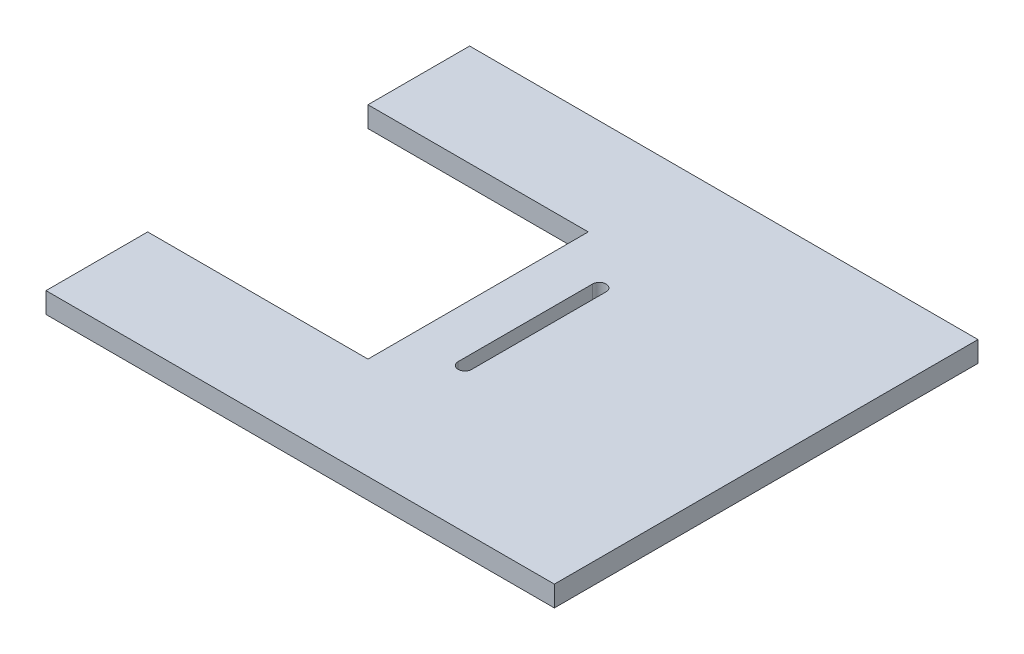
ISO-10303-21;
HEADER;
FILE_DESCRIPTION(('STEP AP214'),'2;1');
FILE_NAME('part.step','',(''),(''),'','','');
FILE_SCHEMA(('AUTOMOTIVE_DESIGN { 1 0 10303 214 1 1 1 1 }'));
ENDSEC;
DATA;
#1=APPLICATION_CONTEXT('core data for automotive mechanical design processes');
#2=APPLICATION_PROTOCOL_DEFINITION('international standard','automotive_design',2000,#1);
#3=PRODUCT_CONTEXT('',#1,'mechanical');
#4=PRODUCT('Part','Part','',(#3));
#5=PRODUCT_RELATED_PRODUCT_CATEGORY('part','',(#4));
#6=PRODUCT_DEFINITION_FORMATION('','',#4);
#7=PRODUCT_DEFINITION_CONTEXT('part definition',#1,'design');
#8=PRODUCT_DEFINITION('design','',#6,#7);
#9=PRODUCT_DEFINITION_SHAPE('','',#8);
#10=(LENGTH_UNIT() NAMED_UNIT(*) SI_UNIT(.MILLI.,.METRE.));
#11=(NAMED_UNIT(*) PLANE_ANGLE_UNIT() SI_UNIT($,.RADIAN.));
#12=(NAMED_UNIT(*) SI_UNIT($,.STERADIAN.) SOLID_ANGLE_UNIT());
#13=UNCERTAINTY_MEASURE_WITH_UNIT(LENGTH_MEASURE(1.E-05),#10,'distance_accuracy_value','');
#14=(GEOMETRIC_REPRESENTATION_CONTEXT(3) GLOBAL_UNCERTAINTY_ASSIGNED_CONTEXT((#13)) GLOBAL_UNIT_ASSIGNED_CONTEXT((#10,
#11,#12)) REPRESENTATION_CONTEXT('',''));
#15=CARTESIAN_POINT('',(0.,0.,0.));
#16=DIRECTION('',(0.,0.,1.));
#17=DIRECTION('',(1.,0.,0.));
#18=AXIS2_PLACEMENT_3D('',#15,#16,#17);
#19=CARTESIAN_POINT('',(0.,12.2,-65.));
#20=DIRECTION('',(0.,0.,-1.));
#21=DIRECTION('',(-1.,0.,0.));
#22=AXIS2_PLACEMENT_3D('',#19,#20,#21);
#23=PLANE('',#22);
#24=DIRECTION('',(1.,0.,0.));
#25=VECTOR('',#24,1.);
#26=CARTESIAN_POINT('',(0.,0.,-65.));
#27=LINE('',#26,#25);
#28=CARTESIAN_POINT('',(-150.,0.,-65.));
#29=VERTEX_POINT('',#28);
#30=CARTESIAN_POINT('',(-19.9999999999999,0.,-65.));
#31=VERTEX_POINT('',#30);
#32=EDGE_CURVE('E159',#29,#31,#27,.T.);
#33=ORIENTED_EDGE('',*,*,#32,.T.);
#34=DIRECTION('',(0.,-1.,0.));
#35=VECTOR('',#34,1.);
#36=CARTESIAN_POINT('',(-19.9999999999999,12.2,-65.));
#37=LINE('',#36,#35);
#38=CARTESIAN_POINT('',(-19.9999999999999,12.2,-65.));
#39=VERTEX_POINT('',#38);
#40=EDGE_CURVE('E240',#39,#31,#37,.T.);
#41=ORIENTED_EDGE('',*,*,#40,.F.);
#42=DIRECTION('',(1.,0.,0.));
#43=VECTOR('',#42,1.);
#44=CARTESIAN_POINT('',(0.,12.2,-65.));
#45=LINE('',#44,#43);
#46=CARTESIAN_POINT('',(-150.,12.2,-65.));
#47=VERTEX_POINT('',#46);
#48=EDGE_CURVE('E164',#47,#39,#45,.T.);
#49=ORIENTED_EDGE('',*,*,#48,.F.);
#50=DIRECTION('',(0.,-1.,0.));
#51=VECTOR('',#50,1.);
#52=CARTESIAN_POINT('',(-150.,12.2,-65.));
#53=LINE('',#52,#51);
#54=EDGE_CURVE('E217',#47,#29,#53,.T.);
#55=ORIENTED_EDGE('',*,*,#54,.T.);
#56=EDGE_LOOP('',(#33,#41,#49,#55));
#57=FACE_BOUND('',#56,.T.);
#58=ADVANCED_FACE('F39',(#57),#23,.F.);
#59=CARTESIAN_POINT('',(-19.9999999999999,12.2,0.));
#60=DIRECTION('',(1.,0.,0.));
#61=DIRECTION('',(0.,0.,-1.));
#62=AXIS2_PLACEMENT_3D('',#59,#60,#61);
#63=PLANE('',#62);
#64=DIRECTION('',(0.,0.,1.));
#65=VECTOR('',#64,1.);
#66=CARTESIAN_POINT('',(-19.9999999999999,0.,0.));
#67=LINE('',#66,#65);
#68=CARTESIAN_POINT('',(-19.9999999999999,0.,65.));
#69=VERTEX_POINT('',#68);
#70=EDGE_CURVE('E194',#31,#69,#67,.T.);
#71=ORIENTED_EDGE('',*,*,#70,.T.);
#72=DIRECTION('',(0.,-1.,0.));
#73=VECTOR('',#72,1.);
#74=CARTESIAN_POINT('',(-19.9999999999999,12.2,65.));
#75=LINE('',#74,#73);
#76=CARTESIAN_POINT('',(-19.9999999999999,12.2,65.));
#77=VERTEX_POINT('',#76);
#78=EDGE_CURVE('E237',#77,#69,#75,.T.);
#79=ORIENTED_EDGE('',*,*,#78,.F.);
#80=DIRECTION('',(0.,0.,1.));
#81=VECTOR('',#80,1.);
#82=CARTESIAN_POINT('',(-19.9999999999999,12.2,0.));
#83=LINE('',#82,#81);
#84=EDGE_CURVE('E168',#39,#77,#83,.T.);
#85=ORIENTED_EDGE('',*,*,#84,.F.);
#86=ORIENTED_EDGE('',*,*,#40,.T.);
#87=EDGE_LOOP('',(#71,#79,#85,#86));
#88=FACE_BOUND('',#87,.T.);
#89=ADVANCED_FACE('F268',(#88),#63,.F.);
#90=CARTESIAN_POINT('',(0.,12.2,65.));
#91=DIRECTION('',(0.,0.,-1.));
#92=DIRECTION('',(-1.,0.,0.));
#93=AXIS2_PLACEMENT_3D('',#90,#91,#92);
#94=PLANE('',#93);
#95=DIRECTION('',(1.,0.,0.));
#96=VECTOR('',#95,1.);
#97=CARTESIAN_POINT('',(0.,0.,65.));
#98=LINE('',#97,#96);
#99=CARTESIAN_POINT('',(-150.,0.,65.));
#100=VERTEX_POINT('',#99);
#101=EDGE_CURVE('E198',#100,#69,#98,.T.);
#102=ORIENTED_EDGE('',*,*,#101,.F.);
#103=DIRECTION('',(0.,-1.,0.));
#104=VECTOR('',#103,1.);
#105=CARTESIAN_POINT('',(-150.,12.2,65.));
#106=LINE('',#105,#104);
#107=CARTESIAN_POINT('',(-150.,12.2,65.));
#108=VERTEX_POINT('',#107);
#109=EDGE_CURVE('E234',#108,#100,#106,.T.);
#110=ORIENTED_EDGE('',*,*,#109,.F.);
#111=DIRECTION('',(1.,0.,0.));
#112=VECTOR('',#111,1.);
#113=CARTESIAN_POINT('',(0.,12.2,65.));
#114=LINE('',#113,#112);
#115=EDGE_CURVE('E172',#108,#77,#114,.T.);
#116=ORIENTED_EDGE('',*,*,#115,.T.);
#117=ORIENTED_EDGE('',*,*,#78,.T.);
#118=EDGE_LOOP('',(#102,#110,#116,#117));
#119=FACE_BOUND('',#118,.T.);
#120=ADVANCED_FACE('F273',(#119),#94,.T.);
#121=CARTESIAN_POINT('',(-150.,12.2,0.));
#122=DIRECTION('',(1.,0.,0.));
#123=DIRECTION('',(0.,0.,-1.));
#124=AXIS2_PLACEMENT_3D('',#121,#122,#123);
#125=PLANE('',#124);
#126=DIRECTION('',(0.,0.,1.));
#127=VECTOR('',#126,1.);
#128=CARTESIAN_POINT('',(-150.,0.,0.));
#129=LINE('',#128,#127);
#130=CARTESIAN_POINT('',(-150.,0.,125.));
#131=VERTEX_POINT('',#130);
#132=EDGE_CURVE('E202',#100,#131,#129,.T.);
#133=ORIENTED_EDGE('',*,*,#132,.T.);
#134=DIRECTION('',(0.,-1.,0.));
#135=VECTOR('',#134,1.);
#136=CARTESIAN_POINT('',(-150.,12.2,125.));
#137=LINE('',#136,#135);
#138=CARTESIAN_POINT('',(-150.,12.2,125.));
#139=VERTEX_POINT('',#138);
#140=EDGE_CURVE('E230',#139,#131,#137,.T.);
#141=ORIENTED_EDGE('',*,*,#140,.F.);
#142=DIRECTION('',(0.,0.,1.));
#143=VECTOR('',#142,1.);
#144=CARTESIAN_POINT('',(-150.,12.2,0.));
#145=LINE('',#144,#143);
#146=EDGE_CURVE('E176',#108,#139,#145,.T.);
#147=ORIENTED_EDGE('',*,*,#146,.F.);
#148=ORIENTED_EDGE('',*,*,#109,.T.);
#149=EDGE_LOOP('',(#133,#141,#147,#148));
#150=FACE_BOUND('',#149,.T.);
#151=ADVANCED_FACE('F305',(#150),#125,.F.);
#152=CARTESIAN_POINT('',(0.,12.2,125.));
#153=DIRECTION('',(0.,0.,-1.));
#154=DIRECTION('',(-1.,0.,0.));
#155=AXIS2_PLACEMENT_3D('',#152,#153,#154);
#156=PLANE('',#155);
#157=DIRECTION('',(1.,0.,0.));
#158=VECTOR('',#157,1.);
#159=CARTESIAN_POINT('',(0.,0.,125.));
#160=LINE('',#159,#158);
#161=CARTESIAN_POINT('',(150.,0.,125.));
#162=VERTEX_POINT('',#161);
#163=EDGE_CURVE('E205',#131,#162,#160,.T.);
#164=ORIENTED_EDGE('',*,*,#163,.T.);
#165=DIRECTION('',(0.,-1.,0.));
#166=VECTOR('',#165,1.);
#167=CARTESIAN_POINT('',(150.,12.2,125.));
#168=LINE('',#167,#166);
#169=CARTESIAN_POINT('',(150.,12.2,125.));
#170=VERTEX_POINT('',#169);
#171=EDGE_CURVE('E227',#170,#162,#168,.T.);
#172=ORIENTED_EDGE('',*,*,#171,.F.);
#173=DIRECTION('',(1.,0.,0.));
#174=VECTOR('',#173,1.);
#175=CARTESIAN_POINT('',(0.,12.2,125.));
#176=LINE('',#175,#174);
#177=EDGE_CURVE('E179',#139,#170,#176,.T.);
#178=ORIENTED_EDGE('',*,*,#177,.F.);
#179=ORIENTED_EDGE('',*,*,#140,.T.);
#180=EDGE_LOOP('',(#164,#172,#178,#179));
#181=FACE_BOUND('',#180,.T.);
#182=ADVANCED_FACE('F301',(#181),#156,.F.);
#183=CARTESIAN_POINT('',(150.,12.2,0.));
#184=DIRECTION('',(1.,0.,0.));
#185=DIRECTION('',(0.,0.,-1.));
#186=AXIS2_PLACEMENT_3D('',#183,#184,#185);
#187=PLANE('',#186);
#188=DIRECTION('',(0.,0.,1.));
#189=VECTOR('',#188,1.);
#190=CARTESIAN_POINT('',(150.,0.,0.));
#191=LINE('',#190,#189);
#192=CARTESIAN_POINT('',(150.,0.,-125.));
#193=VERTEX_POINT('',#192);
#194=EDGE_CURVE('E209',#193,#162,#191,.T.);
#195=ORIENTED_EDGE('',*,*,#194,.F.);
#196=DIRECTION('',(0.,-1.,0.));
#197=VECTOR('',#196,1.);
#198=CARTESIAN_POINT('',(150.,12.2,-125.));
#199=LINE('',#198,#197);
#200=CARTESIAN_POINT('',(150.,12.2,-125.));
#201=VERTEX_POINT('',#200);
#202=EDGE_CURVE('E224',#201,#193,#199,.T.);
#203=ORIENTED_EDGE('',*,*,#202,.F.);
#204=DIRECTION('',(0.,0.,1.));
#205=VECTOR('',#204,1.);
#206=CARTESIAN_POINT('',(150.,12.2,0.));
#207=LINE('',#206,#205);
#208=EDGE_CURVE('E183',#201,#170,#207,.T.);
#209=ORIENTED_EDGE('',*,*,#208,.T.);
#210=ORIENTED_EDGE('',*,*,#171,.T.);
#211=EDGE_LOOP('',(#195,#203,#209,#210));
#212=FACE_BOUND('',#211,.T.);
#213=ADVANCED_FACE('F297',(#212),#187,.T.);
#214=CARTESIAN_POINT('',(0.,12.2,-125.));
#215=DIRECTION('',(0.,0.,-1.));
#216=DIRECTION('',(-1.,0.,0.));
#217=AXIS2_PLACEMENT_3D('',#214,#215,#216);
#218=PLANE('',#217);
#219=DIRECTION('',(1.,0.,0.));
#220=VECTOR('',#219,1.);
#221=CARTESIAN_POINT('',(0.,0.,-125.));
#222=LINE('',#221,#220);
#223=CARTESIAN_POINT('',(-150.,0.,-125.));
#224=VERTEX_POINT('',#223);
#225=EDGE_CURVE('E213',#224,#193,#222,.T.);
#226=ORIENTED_EDGE('',*,*,#225,.F.);
#227=DIRECTION('',(0.,-1.,0.));
#228=VECTOR('',#227,1.);
#229=CARTESIAN_POINT('',(-150.,12.2,-125.));
#230=LINE('',#229,#228);
#231=CARTESIAN_POINT('',(-150.,12.2,-125.));
#232=VERTEX_POINT('',#231);
#233=EDGE_CURVE('E221',#232,#224,#230,.T.);
#234=ORIENTED_EDGE('',*,*,#233,.F.);
#235=DIRECTION('',(1.,0.,0.));
#236=VECTOR('',#235,1.);
#237=CARTESIAN_POINT('',(0.,12.2,-125.));
#238=LINE('',#237,#236);
#239=EDGE_CURVE('E187',#232,#201,#238,.T.);
#240=ORIENTED_EDGE('',*,*,#239,.T.);
#241=ORIENTED_EDGE('',*,*,#202,.T.);
#242=EDGE_LOOP('',(#226,#234,#240,#241));
#243=FACE_BOUND('',#242,.T.);
#244=ADVANCED_FACE('F293',(#243),#218,.T.);
#245=EDGE_CURVE('E169',#224,#29,#129,.T.);
#246=ORIENTED_EDGE('',*,*,#245,.T.);
#247=ORIENTED_EDGE('',*,*,#54,.F.);
#248=EDGE_CURVE('E180',#232,#47,#145,.T.);
#249=ORIENTED_EDGE('',*,*,#248,.F.);
#250=ORIENTED_EDGE('',*,*,#233,.T.);
#251=EDGE_LOOP('',(#246,#247,#249,#250));
#252=FACE_BOUND('',#251,.T.);
#253=ADVANCED_FACE('F290',(#252),#125,.F.);
#254=CARTESIAN_POINT('',(0.,12.2,0.));
#255=DIRECTION('',(0.,1.,0.));
#256=DIRECTION('',(0.,0.,1.));
#257=AXIS2_PLACEMENT_3D('',#254,#255,#256);
#258=PLANE('',#257);
#259=CARTESIAN_POINT('',(11.8843957883299,12.2,-39.6548034544786));
#260=DIRECTION('',(0.,1.,0.));
#261=DIRECTION('',(0.,0.,1.));
#262=AXIS2_PLACEMENT_3D('',#259,#260,#261);
#263=CIRCLE('',#262,4.);
#264=CARTESIAN_POINT('',(15.8843957883299,12.2,-39.6548034544786));
#265=VERTEX_POINT('',#264);
#266=CARTESIAN_POINT('',(7.88439578832994,12.2,-39.6548034544786));
#267=VERTEX_POINT('',#266);
#268=EDGE_CURVE('E54',#265,#267,#263,.T.);
#269=ORIENTED_EDGE('',*,*,#268,.F.);
#270=DIRECTION('',(0.,0.,-1.));
#271=VECTOR('',#270,1.);
#272=CARTESIAN_POINT('',(15.8843957883299,12.2,-39.6548034544786));
#273=LINE('',#272,#271);
#274=CARTESIAN_POINT('',(15.8843957883299,12.2,39.6548034544786));
#275=VERTEX_POINT('',#274);
#276=EDGE_CURVE('E149',#275,#265,#273,.T.);
#277=ORIENTED_EDGE('',*,*,#276,.F.);
#278=CARTESIAN_POINT('',(11.88439578833,12.2,39.6548034544786));
#279=DIRECTION('',(0.,1.,0.));
#280=DIRECTION('',(0.,0.,1.));
#281=AXIS2_PLACEMENT_3D('',#278,#279,#280);
#282=CIRCLE('',#281,4.);
#283=CARTESIAN_POINT('',(7.88439578832995,12.2,39.6548034544786));
#284=VERTEX_POINT('',#283);
#285=EDGE_CURVE('E131',#284,#275,#282,.T.);
#286=ORIENTED_EDGE('',*,*,#285,.F.);
#287=DIRECTION('',(0.,0.,1.));
#288=VECTOR('',#287,1.);
#289=CARTESIAN_POINT('',(7.88439578832994,12.2,-39.6548034544786));
#290=LINE('',#289,#288);
#291=EDGE_CURVE('E141',#267,#284,#290,.T.);
#292=ORIENTED_EDGE('',*,*,#291,.F.);
#293=EDGE_LOOP('',(#269,#277,#286,#292));
#294=FACE_BOUND('',#293,.T.);
#295=ORIENTED_EDGE('',*,*,#48,.T.);
#296=ORIENTED_EDGE('',*,*,#84,.T.);
#297=ORIENTED_EDGE('',*,*,#115,.F.);
#298=ORIENTED_EDGE('',*,*,#146,.T.);
#299=ORIENTED_EDGE('',*,*,#177,.T.);
#300=ORIENTED_EDGE('',*,*,#208,.F.);
#301=ORIENTED_EDGE('',*,*,#239,.F.);
#302=ORIENTED_EDGE('',*,*,#248,.T.);
#303=EDGE_LOOP('',(#295,#296,#297,#298,#299,#300,#301,#302));
#304=FACE_BOUND('',#303,.T.);
#305=ADVANCED_FACE('F146',(#294,#304),#258,.T.);
#306=CARTESIAN_POINT('',(0.,0.,0.));
#307=DIRECTION('',(0.,1.,0.));
#308=DIRECTION('',(0.,0.,1.));
#309=AXIS2_PLACEMENT_3D('',#306,#307,#308);
#310=PLANE('',#309);
#311=DIRECTION('',(0.,0.,-1.));
#312=VECTOR('',#311,1.);
#313=CARTESIAN_POINT('',(15.8843957883299,0.,0.));
#314=LINE('',#313,#312);
#315=CARTESIAN_POINT('',(15.8843957883299,0.,39.6548034544786));
#316=VERTEX_POINT('',#315);
#317=CARTESIAN_POINT('',(15.8843957883299,0.,-39.6548034544786));
#318=VERTEX_POINT('',#317);
#319=EDGE_CURVE('E47',#316,#318,#314,.T.);
#320=ORIENTED_EDGE('',*,*,#319,.T.);
#321=CARTESIAN_POINT('',(11.8843957883299,0.,-39.6548034544786));
#322=DIRECTION('',(0.,1.,0.));
#323=DIRECTION('',(0.,0.,1.));
#324=AXIS2_PLACEMENT_3D('',#321,#322,#323);
#325=CIRCLE('',#324,4.);
#326=CARTESIAN_POINT('',(7.88439578832994,0.,-39.6548034544786));
#327=VERTEX_POINT('',#326);
#328=EDGE_CURVE('E11',#318,#327,#325,.T.);
#329=ORIENTED_EDGE('',*,*,#328,.T.);
#330=DIRECTION('',(0.,0.,1.));
#331=VECTOR('',#330,1.);
#332=CARTESIAN_POINT('',(7.88439578832995,0.,0.));
#333=LINE('',#332,#331);
#334=CARTESIAN_POINT('',(7.88439578832995,0.,39.6548034544786));
#335=VERTEX_POINT('',#334);
#336=EDGE_CURVE('E244',#327,#335,#333,.T.);
#337=ORIENTED_EDGE('',*,*,#336,.T.);
#338=CARTESIAN_POINT('',(11.88439578833,0.,39.6548034544786));
#339=DIRECTION('',(0.,1.,0.));
#340=DIRECTION('',(0.,0.,1.));
#341=AXIS2_PLACEMENT_3D('',#338,#339,#340);
#342=CIRCLE('',#341,4.);
#343=EDGE_CURVE('E134',#335,#316,#342,.T.);
#344=ORIENTED_EDGE('',*,*,#343,.T.);
#345=EDGE_LOOP('',(#320,#329,#337,#344));
#346=FACE_BOUND('',#345,.T.);
#347=ORIENTED_EDGE('',*,*,#32,.F.);
#348=ORIENTED_EDGE('',*,*,#245,.F.);
#349=ORIENTED_EDGE('',*,*,#225,.T.);
#350=ORIENTED_EDGE('',*,*,#194,.T.);
#351=ORIENTED_EDGE('',*,*,#163,.F.);
#352=ORIENTED_EDGE('',*,*,#132,.F.);
#353=ORIENTED_EDGE('',*,*,#101,.T.);
#354=ORIENTED_EDGE('',*,*,#70,.F.);
#355=EDGE_LOOP('',(#347,#348,#349,#350,#351,#352,#353,#354));
#356=FACE_BOUND('',#355,.T.);
#357=ADVANCED_FACE('F251',(#346,#356),#310,.F.);
#358=CARTESIAN_POINT('',(11.8843957883299,-17.8,-39.6548034544786));
#359=DIRECTION('',(0.,1.,0.));
#360=DIRECTION('',(0.,0.,1.));
#361=AXIS2_PLACEMENT_3D('',#358,#359,#360);
#362=CYLINDRICAL_SURFACE('',#361,4.);
#363=DIRECTION('',(0.,1.,0.));
#364=VECTOR('',#363,1.);
#365=CARTESIAN_POINT('',(15.8843957883299,-17.8,-39.6548034544786));
#366=LINE('',#365,#364);
#367=EDGE_CURVE('E156',#318,#265,#366,.T.);
#368=ORIENTED_EDGE('',*,*,#367,.T.);
#369=ORIENTED_EDGE('',*,*,#268,.T.);
#370=DIRECTION('',(0.,1.,0.));
#371=VECTOR('',#370,1.);
#372=CARTESIAN_POINT('',(7.88439578832994,-17.8,-39.6548034544786));
#373=LINE('',#372,#371);
#374=EDGE_CURVE('E138',#327,#267,#373,.T.);
#375=ORIENTED_EDGE('',*,*,#374,.F.);
#376=ORIENTED_EDGE('',*,*,#328,.F.);
#377=EDGE_LOOP('',(#368,#369,#375,#376));
#378=FACE_BOUND('',#377,.T.);
#379=ADVANCED_FACE('F256',(#378),#362,.F.);
#380=CARTESIAN_POINT('',(15.8843957883299,-17.8,-39.6548034544786));
#381=DIRECTION('',(1.,0.,0.));
#382=DIRECTION('',(0.,0.,-1.));
#383=AXIS2_PLACEMENT_3D('',#380,#381,#382);
#384=PLANE('',#383);
#385=DIRECTION('',(0.,1.,0.));
#386=VECTOR('',#385,1.);
#387=CARTESIAN_POINT('',(15.8843957883299,-17.8,39.6548034544786));
#388=LINE('',#387,#386);
#389=EDGE_CURVE('E137',#316,#275,#388,.T.);
#390=ORIENTED_EDGE('',*,*,#389,.T.);
#391=ORIENTED_EDGE('',*,*,#276,.T.);
#392=ORIENTED_EDGE('',*,*,#367,.F.);
#393=ORIENTED_EDGE('',*,*,#319,.F.);
#394=EDGE_LOOP('',(#390,#391,#392,#393));
#395=FACE_BOUND('',#394,.T.);
#396=ADVANCED_FACE('F255',(#395),#384,.F.);
#397=CARTESIAN_POINT('',(11.88439578833,-17.8,39.6548034544786));
#398=DIRECTION('',(0.,1.,0.));
#399=DIRECTION('',(0.,0.,1.));
#400=AXIS2_PLACEMENT_3D('',#397,#398,#399);
#401=CYLINDRICAL_SURFACE('',#400,4.);
#402=DIRECTION('',(0.,1.,0.));
#403=VECTOR('',#402,1.);
#404=CARTESIAN_POINT('',(7.88439578832995,-17.8,39.6548034544786));
#405=LINE('',#404,#403);
#406=EDGE_CURVE('E62',#335,#284,#405,.T.);
#407=ORIENTED_EDGE('',*,*,#406,.T.);
#408=ORIENTED_EDGE('',*,*,#285,.T.);
#409=ORIENTED_EDGE('',*,*,#389,.F.);
#410=ORIENTED_EDGE('',*,*,#343,.F.);
#411=EDGE_LOOP('',(#407,#408,#409,#410));
#412=FACE_BOUND('',#411,.T.);
#413=ADVANCED_FACE('F128',(#412),#401,.F.);
#414=CARTESIAN_POINT('',(7.88439578832994,-17.8,-39.6548034544786));
#415=DIRECTION('',(-1.,0.,0.));
#416=DIRECTION('',(0.,0.,1.));
#417=AXIS2_PLACEMENT_3D('',#414,#415,#416);
#418=PLANE('',#417);
#419=ORIENTED_EDGE('',*,*,#374,.T.);
#420=ORIENTED_EDGE('',*,*,#291,.T.);
#421=ORIENTED_EDGE('',*,*,#406,.F.);
#422=ORIENTED_EDGE('',*,*,#336,.F.);
#423=EDGE_LOOP('',(#419,#420,#421,#422));
#424=FACE_BOUND('',#423,.T.);
#425=ADVANCED_FACE('F142',(#424),#418,.F.);
#426=CLOSED_SHELL('',(#58,#89,#120,#151,#182,#213,#244,#253,#305,#357,#379,#396,#413,#425));
#427=MANIFOLD_SOLID_BREP('B2',#426);
#428=ADVANCED_BREP_SHAPE_REPRESENTATION('',(#18,#427),#14);
#429=SHAPE_DEFINITION_REPRESENTATION(#9,#428);
ENDSEC;
END-ISO-10303-21;
